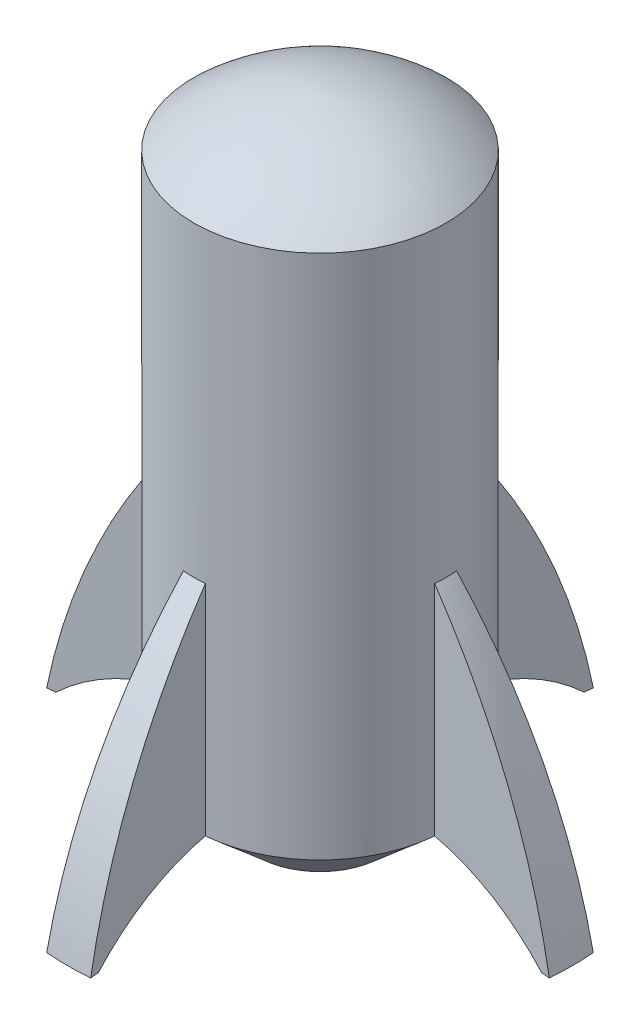
ISO-10303-21;
HEADER;
FILE_DESCRIPTION(('STEP AP214'),'2;1');
FILE_NAME('part.step','',(''),(''),'','','');
FILE_SCHEMA(('AUTOMOTIVE_DESIGN { 1 0 10303 214 1 1 1 1 }'));
ENDSEC;
DATA;
#1=APPLICATION_CONTEXT('core data for automotive mechanical design processes');
#2=APPLICATION_PROTOCOL_DEFINITION('international standard','automotive_design',2000,#1);
#3=PRODUCT_CONTEXT('',#1,'mechanical');
#4=PRODUCT('Part','Part','',(#3));
#5=PRODUCT_RELATED_PRODUCT_CATEGORY('part','',(#4));
#6=PRODUCT_DEFINITION_FORMATION('','',#4);
#7=PRODUCT_DEFINITION_CONTEXT('part definition',#1,'design');
#8=PRODUCT_DEFINITION('design','',#6,#7);
#9=PRODUCT_DEFINITION_SHAPE('','',#8);
#10=(LENGTH_UNIT() NAMED_UNIT(*) SI_UNIT(.MILLI.,.METRE.));
#11=(NAMED_UNIT(*) PLANE_ANGLE_UNIT() SI_UNIT($,.RADIAN.));
#12=(NAMED_UNIT(*) SI_UNIT($,.STERADIAN.) SOLID_ANGLE_UNIT());
#13=UNCERTAINTY_MEASURE_WITH_UNIT(LENGTH_MEASURE(1.E-05),#10,'distance_accuracy_value','');
#14=(GEOMETRIC_REPRESENTATION_CONTEXT(3) GLOBAL_UNCERTAINTY_ASSIGNED_CONTEXT((#13)) GLOBAL_UNIT_ASSIGNED_CONTEXT((#10,
#11,#12)) REPRESENTATION_CONTEXT('',''));
#15=CARTESIAN_POINT('',(0.,0.,0.));
#16=DIRECTION('',(0.,0.,1.));
#17=DIRECTION('',(1.,0.,0.));
#18=AXIS2_PLACEMENT_3D('',#15,#16,#17);
#19=CARTESIAN_POINT('',(0.,100.066272480097,2.57349100796131));
#20=DIRECTION('',(-1.,0.,0.));
#21=DIRECTION('',(0.,0.,-1.));
#22=AXIS2_PLACEMENT_3D('',#19,#20,#21);
#23=CIRCLE('',#22,50.);
#24=TRIMMED_CURVE('',#23,(PARAMETER_VALUE(-1.51930375435487)),
(PARAMETER_VALUE(1.51930375435487)),.T.,.PARAMETER.);
#25=CARTESIAN_POINT('',(0.,100.066272480097,0.));
#26=DIRECTION('',(0.,-1.,0.));
#27=AXIS1_PLACEMENT('',#25,#26);
#28=SURFACE_OF_REVOLUTION('',#24,#27);
#29=CARTESIAN_POINT('',(0.,150.,0.));
#30=VERTEX_POINT('',#29);
#31=VERTEX_LOOP('',#30);
#32=FACE_BOUND('',#31,.T.);
#33=CARTESIAN_POINT('',(0.,138.,0.));
#34=DIRECTION('',(0.,-1.,0.));
#35=DIRECTION('',(0.,0.,-1.));
#36=AXIS2_PLACEMENT_3D('',#33,#34,#35);
#37=CIRCLE('',#36,30.);
#38=CARTESIAN_POINT('',(0.,138.,-30.));
#39=VERTEX_POINT('',#38);
#40=EDGE_CURVE('E358',#39,#39,#37,.T.);
#41=ORIENTED_EDGE('',*,*,#40,.F.);
#42=EDGE_LOOP('',(#41));
#43=FACE_BOUND('',#42,.T.);
#44=ADVANCED_FACE('F43',(#32,#43),#28,.T.);
#45=CARTESIAN_POINT('',(0.,0.,0.));
#46=DIRECTION('',(0.,-1.,0.));
#47=DIRECTION('',(0.,0.,-1.));
#48=AXIS2_PLACEMENT_3D('',#45,#46,#47);
#49=CYLINDRICAL_SURFACE('',#48,30.);
#50=DIRECTION('',(0.,-1.,0.));
#51=VECTOR('',#50,1.);
#52=CARTESIAN_POINT('',(-29.8858409427524,65.,2.61467228242944));
#53=LINE('',#52,#51);
#54=CARTESIAN_POINT('',(-29.8858409427524,65.,2.61467228242944));
#55=VERTEX_POINT('',#54);
#56=CARTESIAN_POINT('',(-29.8858409427524,13.,2.61467228242944));
#57=VERTEX_POINT('',#56);
#58=EDGE_CURVE('E201',#55,#57,#53,.T.);
#59=ORIENTED_EDGE('',*,*,#58,.T.);
#60=CARTESIAN_POINT('',(0.,13.,0.));
#61=DIRECTION('',(0.,-1.,0.));
#62=DIRECTION('',(0.,0.,-1.));
#63=AXIS2_PLACEMENT_3D('',#60,#61,#62);
#64=CIRCLE('',#63,30.);
#65=CARTESIAN_POINT('',(-2.61467228242975,13.,29.8858409427524));
#66=VERTEX_POINT('',#65);
#67=EDGE_CURVE('E701',#66,#57,#64,.T.);
#68=ORIENTED_EDGE('',*,*,#67,.F.);
#69=DIRECTION('',(0.,-1.,0.));
#70=VECTOR('',#69,1.);
#71=CARTESIAN_POINT('',(-2.61467228242975,65.,29.8858409427524));
#72=LINE('',#71,#70);
#73=CARTESIAN_POINT('',(-2.61467228242975,65.,29.8858409427524));
#74=VERTEX_POINT('',#73);
#75=EDGE_CURVE('E223',#74,#66,#72,.T.);
#76=ORIENTED_EDGE('',*,*,#75,.F.);
#77=CARTESIAN_POINT('',(0.,65.,0.));
#78=DIRECTION('',(0.,-1.,0.));
#79=DIRECTION('',(0.,0.,1.));
#80=AXIS2_PLACEMENT_3D('',#77,#78,#79);
#81=CIRCLE('',#80,30.);
#82=CARTESIAN_POINT('',(2.61467228242975,65.,29.8858409427524));
#83=VERTEX_POINT('',#82);
#84=EDGE_CURVE('E248',#83,#74,#81,.T.);
#85=ORIENTED_EDGE('',*,*,#84,.F.);
#86=DIRECTION('',(0.,-1.,0.));
#87=VECTOR('',#86,1.);
#88=CARTESIAN_POINT('',(2.61467228242975,65.,29.8858409427524));
#89=LINE('',#88,#87);
#90=CARTESIAN_POINT('',(2.61467228242975,13.,29.8858409427524));
#91=VERTEX_POINT('',#90);
#92=EDGE_CURVE('E236',#83,#91,#89,.T.);
#93=ORIENTED_EDGE('',*,*,#92,.T.);
#94=CARTESIAN_POINT('',(29.8858409427524,13.,2.61467228242985));
#95=VERTEX_POINT('',#94);
#96=EDGE_CURVE('E359',#95,#91,#64,.T.);
#97=ORIENTED_EDGE('',*,*,#96,.F.);
#98=DIRECTION('',(0.,-1.,0.));
#99=VECTOR('',#98,1.);
#100=CARTESIAN_POINT('',(29.8858409427524,65.,2.61467228242986));
#101=LINE('',#100,#99);
#102=CARTESIAN_POINT('',(29.8858409427524,65.,2.61467228242986));
#103=VERTEX_POINT('',#102);
#104=EDGE_CURVE('E265',#103,#95,#101,.T.);
#105=ORIENTED_EDGE('',*,*,#104,.F.);
#106=CARTESIAN_POINT('',(0.,65.,0.));
#107=DIRECTION('',(0.,-1.,0.));
#108=DIRECTION('',(1.,0.,0.));
#109=AXIS2_PLACEMENT_3D('',#106,#107,#108);
#110=CIRCLE('',#109,30.);
#111=CARTESIAN_POINT('',(29.8858409427524,65.,-2.61467228242965));
#112=VERTEX_POINT('',#111);
#113=EDGE_CURVE('E293',#112,#103,#110,.T.);
#114=ORIENTED_EDGE('',*,*,#113,.F.);
#115=DIRECTION('',(0.,-1.,0.));
#116=VECTOR('',#115,1.);
#117=CARTESIAN_POINT('',(29.8858409427524,65.,-2.61467228242965));
#118=LINE('',#117,#116);
#119=CARTESIAN_POINT('',(29.8858409427524,13.,-2.61467228242965));
#120=VERTEX_POINT('',#119);
#121=EDGE_CURVE('E281',#112,#120,#118,.T.);
#122=ORIENTED_EDGE('',*,*,#121,.T.);
#123=CARTESIAN_POINT('',(2.61467228242975,13.,-29.8858409427524));
#124=VERTEX_POINT('',#123);
#125=EDGE_CURVE('E354',#124,#120,#64,.T.);
#126=ORIENTED_EDGE('',*,*,#125,.F.);
#127=DIRECTION('',(0.,-1.,0.));
#128=VECTOR('',#127,1.);
#129=CARTESIAN_POINT('',(2.61467228242975,65.,-29.8858409427524));
#130=LINE('',#129,#128);
#131=CARTESIAN_POINT('',(2.61467228242975,65.,-29.8858409427524));
#132=VERTEX_POINT('',#131);
#133=EDGE_CURVE('E310',#132,#124,#130,.T.);
#134=ORIENTED_EDGE('',*,*,#133,.F.);
#135=CARTESIAN_POINT('',(0.,65.,0.));
#136=DIRECTION('',(0.,-1.,0.));
#137=DIRECTION('',(0.,0.,-1.));
#138=AXIS2_PLACEMENT_3D('',#135,#136,#137);
#139=CIRCLE('',#138,30.);
#140=CARTESIAN_POINT('',(-2.61467228242975,65.,-29.8858409427524));
#141=VERTEX_POINT('',#140);
#142=EDGE_CURVE('E337',#141,#132,#139,.T.);
#143=ORIENTED_EDGE('',*,*,#142,.F.);
#144=DIRECTION('',(0.,-1.,0.));
#145=VECTOR('',#144,1.);
#146=CARTESIAN_POINT('',(-2.61467228242975,65.,-29.8858409427524));
#147=LINE('',#146,#145);
#148=CARTESIAN_POINT('',(-2.61467228242975,13.,-29.8858409427524));
#149=VERTEX_POINT('',#148);
#150=EDGE_CURVE('E326',#141,#149,#147,.T.);
#151=ORIENTED_EDGE('',*,*,#150,.T.);
#152=CARTESIAN_POINT('',(-29.8858409427523,13.,-2.61467228243006));
#153=VERTEX_POINT('',#152);
#154=EDGE_CURVE('E190',#153,#149,#64,.T.);
#155=ORIENTED_EDGE('',*,*,#154,.F.);
#156=DIRECTION('',(0.,-1.,0.));
#157=VECTOR('',#156,1.);
#158=CARTESIAN_POINT('',(-29.8858409427523,65.,-2.61467228243006));
#159=LINE('',#158,#157);
#160=CARTESIAN_POINT('',(-29.8858409427523,65.,-2.61467228243006));
#161=VERTEX_POINT('',#160);
#162=EDGE_CURVE('E181',#161,#153,#159,.T.);
#163=ORIENTED_EDGE('',*,*,#162,.F.);
#164=CARTESIAN_POINT('',(0.,65.,0.));
#165=DIRECTION('',(0.,-1.,0.));
#166=DIRECTION('',(-1.,0.,0.));
#167=AXIS2_PLACEMENT_3D('',#164,#165,#166);
#168=CIRCLE('',#167,30.);
#169=EDGE_CURVE('E165',#55,#161,#168,.T.);
#170=ORIENTED_EDGE('',*,*,#169,.F.);
#171=EDGE_LOOP('',(#59,#68,#76,#85,#93,#97,#105,#114,#122,#126,#134,#143,#151,#155,#163,#170));
#172=FACE_BOUND('',#171,.T.);
#173=ORIENTED_EDGE('',*,*,#40,.T.);
#174=EDGE_LOOP('',(#173));
#175=FACE_BOUND('',#174,.T.);
#176=ADVANCED_FACE('F187',(#172,#175),#49,.T.);
#177=CARTESIAN_POINT('',(0.,0.,0.));
#178=DIRECTION('',(0.,1.,0.));
#179=DIRECTION('',(0.,0.,1.));
#180=AXIS2_PLACEMENT_3D('',#177,#178,#179);
#181=CONICAL_SURFACE('',#180,15.,0.856705628182739);
#182=ORIENTED_EDGE('',*,*,#125,.T.);
#183=CARTESIAN_POINT('',(0.,13.,0.));
#184=DIRECTION('',(0.,-1.,0.));
#185=DIRECTION('',(1.,0.,0.));
#186=AXIS2_PLACEMENT_3D('',#183,#184,#185);
#187=CIRCLE('',#186,30.);
#188=EDGE_CURVE('E296',#120,#95,#187,.T.);
#189=ORIENTED_EDGE('',*,*,#188,.T.);
#190=ORIENTED_EDGE('',*,*,#96,.T.);
#191=CARTESIAN_POINT('',(0.,13.,0.));
#192=DIRECTION('',(0.,-1.,0.));
#193=DIRECTION('',(0.,0.,1.));
#194=AXIS2_PLACEMENT_3D('',#191,#192,#193);
#195=CIRCLE('',#194,30.);
#196=EDGE_CURVE('E251',#91,#66,#195,.T.);
#197=ORIENTED_EDGE('',*,*,#196,.T.);
#198=ORIENTED_EDGE('',*,*,#67,.T.);
#199=CARTESIAN_POINT('',(0.,13.,0.));
#200=DIRECTION('',(0.,-1.,0.));
#201=DIRECTION('',(-1.,0.,0.));
#202=AXIS2_PLACEMENT_3D('',#199,#200,#201);
#203=CIRCLE('',#202,30.);
#204=EDGE_CURVE('E175',#57,#153,#203,.T.);
#205=ORIENTED_EDGE('',*,*,#204,.T.);
#206=ORIENTED_EDGE('',*,*,#154,.T.);
#207=CARTESIAN_POINT('',(0.,13.,0.));
#208=DIRECTION('',(0.,-1.,0.));
#209=DIRECTION('',(0.,0.,-1.));
#210=AXIS2_PLACEMENT_3D('',#207,#208,#209);
#211=CIRCLE('',#210,30.);
#212=EDGE_CURVE('E340',#149,#124,#211,.T.);
#213=ORIENTED_EDGE('',*,*,#212,.T.);
#214=EDGE_LOOP('',(#182,#189,#190,#197,#198,#205,#206,#213));
#215=FACE_BOUND('',#214,.T.);
#216=CARTESIAN_POINT('',(0.,0.,0.));
#217=DIRECTION('',(0.,-1.,0.));
#218=DIRECTION('',(0.,0.,-1.));
#219=AXIS2_PLACEMENT_3D('',#216,#217,#218);
#220=CIRCLE('',#219,15.);
#221=CARTESIAN_POINT('',(0.,0.,-15.));
#222=VERTEX_POINT('',#221);
#223=EDGE_CURVE('E350',#222,#222,#220,.T.);
#224=ORIENTED_EDGE('',*,*,#223,.F.);
#225=EDGE_LOOP('',(#224));
#226=FACE_BOUND('',#225,.T.);
#227=ADVANCED_FACE('F393',(#215,#226),#181,.T.);
#228=CARTESIAN_POINT('',(0.,0.,0.));
#229=DIRECTION('',(0.,-1.,0.));
#230=DIRECTION('',(0.,0.,-1.));
#231=AXIS2_PLACEMENT_3D('',#228,#229,#230);
#232=PLANE('',#231);
#233=ORIENTED_EDGE('',*,*,#223,.T.);
#234=EDGE_LOOP('',(#233));
#235=FACE_BOUND('',#234,.T.);
#236=ADVANCED_FACE('F396',(#235),#232,.T.);
#237=CARTESIAN_POINT('',(0.,-28.5427678942815,0.));
#238=DIRECTION('',(0.,-1.,0.));
#239=DIRECTION('',(0.,0.,-1.));
#240=AXIS2_PLACEMENT_3D('',#237,#238,#239);
#241=DEGENERATE_TOROIDAL_SURFACE('',#240,87.2593304376099,150.,.F.);
#242=CARTESIAN_POINT('',(0.,0.,0.));
#243=DIRECTION('',(0.,-1.,0.));
#244=DIRECTION('',(0.,0.,-1.));
#245=AXIS2_PLACEMENT_3D('',#242,#243,#244);
#246=CIRCLE('',#245,60.);
#247=CARTESIAN_POINT('',(-5.2293445648595,0.,-59.7716818855047));
#248=VERTEX_POINT('',#247);
#249=CARTESIAN_POINT('',(5.2293445648595,0.,-59.7716818855047));
#250=VERTEX_POINT('',#249);
#251=EDGE_CURVE('E347',#248,#250,#246,.T.);
#252=ORIENTED_EDGE('',*,*,#251,.F.);
#253=CARTESIAN_POINT('',(7.60515175595324,-28.5427678942815,86.9272823409826));
#254=DIRECTION('',(0.996194698091746,0.,-0.0871557427476583));
#255=DIRECTION('',(0.0871557427476583,0.,0.996194698091746));
#256=AXIS2_PLACEMENT_3D('',#253,#254,#255);
#257=CIRCLE('',#256,150.);
#258=EDGE_CURVE('E322',#248,#141,#257,.T.);
#259=ORIENTED_EDGE('',*,*,#258,.T.);
#260=ORIENTED_EDGE('',*,*,#142,.T.);
#261=CARTESIAN_POINT('',(-7.60515175595324,-28.5427678942815,86.9272823409826));
#262=DIRECTION('',(0.996194698091746,0.,0.0871557427476584));
#263=DIRECTION('',(-0.0871557427476584,0.,0.996194698091746));
#264=AXIS2_PLACEMENT_3D('',#261,#262,#263);
#265=CIRCLE('',#264,150.);
#266=EDGE_CURVE('E306',#250,#132,#265,.T.);
#267=ORIENTED_EDGE('',*,*,#266,.F.);
#268=EDGE_LOOP('',(#252,#259,#260,#267));
#269=FACE_BOUND('',#268,.T.);
#270=ADVANCED_FACE('F400',(#269),#241,.F.);
#271=CARTESIAN_POINT('',(-5.2293445648595,0.,-59.7716818855047));
#272=DIRECTION('',(0.,-1.,0.));
#273=DIRECTION('',(0.,0.,-1.));
#274=AXIS2_PLACEMENT_3D('',#271,#272,#273);
#275=PLANE('',#274);
#276=CARTESIAN_POINT('',(0.,0.,0.));
#277=DIRECTION('',(0.,-1.,0.));
#278=DIRECTION('',(0.,0.,-1.));
#279=AXIS2_PLACEMENT_3D('',#276,#277,#278);
#280=CIRCLE('',#279,58.);
#281=CARTESIAN_POINT('',(-5.05503307936418,0.,-57.7792924893212));
#282=VERTEX_POINT('',#281);
#283=CARTESIAN_POINT('',(5.05503307936419,0.,-57.7792924893212));
#284=VERTEX_POINT('',#283);
#285=EDGE_CURVE('E344',#282,#284,#280,.T.);
#286=ORIENTED_EDGE('',*,*,#285,.F.);
#287=DIRECTION('',(-0.0871557427476583,0.,-0.996194698091746));
#288=VECTOR('',#287,1.);
#289=CARTESIAN_POINT('',(-5.2293445648595,0.,-59.7716818855047));
#290=LINE('',#289,#288);
#291=EDGE_CURVE('E333',#282,#248,#290,.T.);
#292=ORIENTED_EDGE('',*,*,#291,.T.);
#293=ORIENTED_EDGE('',*,*,#251,.T.);
#294=DIRECTION('',(0.0871557427476584,0.,-0.996194698091746));
#295=VECTOR('',#294,1.);
#296=CARTESIAN_POINT('',(5.2293445648595,0.,-59.7716818855047));
#297=LINE('',#296,#295);
#298=EDGE_CURVE('E318',#284,#250,#297,.T.);
#299=ORIENTED_EDGE('',*,*,#298,.F.);
#300=EDGE_LOOP('',(#286,#292,#293,#299));
#301=FACE_BOUND('',#300,.T.);
#302=ADVANCED_FACE('F402',(#301),#275,.T.);
#303=CARTESIAN_POINT('',(0.,-36.6354050513055,0.));
#304=DIRECTION('',(0.,-1.,0.));
#305=DIRECTION('',(0.,0.,-1.));
#306=AXIS2_PLACEMENT_3D('',#303,#304,#305);
#307=DEGENERATE_TOROIDAL_SURFACE('',#306,23.9728476547511,50.,.T.);
#308=ORIENTED_EDGE('',*,*,#212,.F.);
#309=CARTESIAN_POINT('',(-2.08937134312629,-36.6354050513055,-23.8816237318241));
#310=DIRECTION('',(-0.996194698091746,0.,0.0871557427476583));
#311=DIRECTION('',(0.0871557427476583,0.,0.996194698091746));
#312=AXIS2_PLACEMENT_3D('',#309,#310,#311);
#313=CIRCLE('',#312,50.);
#314=EDGE_CURVE('E329',#149,#282,#313,.T.);
#315=ORIENTED_EDGE('',*,*,#314,.T.);
#316=ORIENTED_EDGE('',*,*,#285,.T.);
#317=CARTESIAN_POINT('',(2.08937134312629,-36.6354050513055,-23.8816237318241));
#318=DIRECTION('',(-0.996194698091746,0.,-0.0871557427476584));
#319=DIRECTION('',(-0.0871557427476584,0.,0.996194698091746));
#320=AXIS2_PLACEMENT_3D('',#317,#318,#319);
#321=CIRCLE('',#320,50.);
#322=EDGE_CURVE('E314',#124,#284,#321,.T.);
#323=ORIENTED_EDGE('',*,*,#322,.F.);
#324=EDGE_LOOP('',(#308,#315,#316,#323));
#325=FACE_BOUND('',#324,.T.);
#326=ADVANCED_FACE('F405',(#325),#307,.F.);
#327=CARTESIAN_POINT('',(7.60515175595324,-28.5427678942815,86.9272823409826));
#328=DIRECTION('',(-0.996194698091746,0.,0.0871557427476583));
#329=DIRECTION('',(0.0871557427476583,0.,0.996194698091746));
#330=AXIS2_PLACEMENT_3D('',#327,#328,#329);
#331=PLANE('',#330);
#332=ORIENTED_EDGE('',*,*,#258,.F.);
#333=ORIENTED_EDGE('',*,*,#291,.F.);
#334=ORIENTED_EDGE('',*,*,#314,.F.);
#335=ORIENTED_EDGE('',*,*,#150,.F.);
#336=EDGE_LOOP('',(#332,#333,#334,#335));
#337=FACE_BOUND('',#336,.T.);
#338=ADVANCED_FACE('F409',(#337),#331,.T.);
#339=CARTESIAN_POINT('',(-7.60515175595324,-28.5427678942815,86.9272823409826));
#340=DIRECTION('',(-0.996194698091746,0.,-0.0871557427476584));
#341=DIRECTION('',(-0.0871557427476584,0.,0.996194698091746));
#342=AXIS2_PLACEMENT_3D('',#339,#340,#341);
#343=PLANE('',#342);
#344=ORIENTED_EDGE('',*,*,#266,.T.);
#345=ORIENTED_EDGE('',*,*,#133,.T.);
#346=ORIENTED_EDGE('',*,*,#322,.T.);
#347=ORIENTED_EDGE('',*,*,#298,.T.);
#348=EDGE_LOOP('',(#344,#345,#346,#347));
#349=FACE_BOUND('',#348,.T.);
#350=ADVANCED_FACE('F416',(#349),#343,.F.);
#351=CARTESIAN_POINT('',(0.,-28.5427678942815,0.));
#352=DIRECTION('',(0.,-1.,0.));
#353=DIRECTION('',(1.,0.,0.));
#354=AXIS2_PLACEMENT_3D('',#351,#352,#353);
#355=DEGENERATE_TOROIDAL_SURFACE('',#354,87.2593304376099,150.,.F.);
#356=CARTESIAN_POINT('',(0.,0.,0.));
#357=DIRECTION('',(0.,-1.,0.));
#358=DIRECTION('',(1.,0.,0.));
#359=AXIS2_PLACEMENT_3D('',#356,#357,#358);
#360=CIRCLE('',#359,60.);
#361=CARTESIAN_POINT('',(59.7716818855048,0.,-5.22934456485929));
#362=VERTEX_POINT('',#361);
#363=CARTESIAN_POINT('',(59.7716818855047,0.,5.22934456485971));
#364=VERTEX_POINT('',#363);
#365=EDGE_CURVE('E303',#362,#364,#360,.T.);
#366=ORIENTED_EDGE('',*,*,#365,.F.);
#367=CARTESIAN_POINT('',(-86.9272823409827,-28.5427678942815,7.60515175595294));
#368=DIRECTION('',(0.0871557427476549,0.,0.996194698091746));
#369=DIRECTION('',(-0.996194698091746,0.,0.0871557427476549));
#370=AXIS2_PLACEMENT_3D('',#367,#368,#369);
#371=CIRCLE('',#370,150.);
#372=EDGE_CURVE('E277',#362,#112,#371,.T.);
#373=ORIENTED_EDGE('',*,*,#372,.T.);
#374=ORIENTED_EDGE('',*,*,#113,.T.);
#375=CARTESIAN_POINT('',(-86.9272823409826,-28.5427678942815,-7.60515175595354));
#376=DIRECTION('',(-0.0871557427476618,0.,0.996194698091745));
#377=DIRECTION('',(-0.996194698091745,0.,-0.0871557427476618));
#378=AXIS2_PLACEMENT_3D('',#375,#376,#377);
#379=CIRCLE('',#378,150.);
#380=EDGE_CURVE('E261',#364,#103,#379,.T.);
#381=ORIENTED_EDGE('',*,*,#380,.F.);
#382=EDGE_LOOP('',(#366,#373,#374,#381));
#383=FACE_BOUND('',#382,.T.);
#384=ADVANCED_FACE('F420',(#383),#355,.F.);
#385=CARTESIAN_POINT('',(59.7716818855048,0.,-5.22934456485929));
#386=DIRECTION('',(0.,-1.,0.));
#387=DIRECTION('',(1.,0.,0.));
#388=AXIS2_PLACEMENT_3D('',#385,#386,#387);
#389=PLANE('',#388);
#390=CARTESIAN_POINT('',(0.,0.,0.));
#391=DIRECTION('',(0.,-1.,0.));
#392=DIRECTION('',(1.,0.,0.));
#393=AXIS2_PLACEMENT_3D('',#390,#391,#392);
#394=CIRCLE('',#393,58.);
#395=CARTESIAN_POINT('',(57.7792924893213,0.,-5.05503307936398));
#396=VERTEX_POINT('',#395);
#397=CARTESIAN_POINT('',(57.7792924893212,0.,5.05503307936439));
#398=VERTEX_POINT('',#397);
#399=EDGE_CURVE('E300',#396,#398,#394,.T.);
#400=ORIENTED_EDGE('',*,*,#399,.F.);
#401=DIRECTION('',(0.996194698091746,0.,-0.0871557427476549));
#402=VECTOR('',#401,1.);
#403=CARTESIAN_POINT('',(59.7716818855048,0.,-5.22934456485929));
#404=LINE('',#403,#402);
#405=EDGE_CURVE('E289',#396,#362,#404,.T.);
#406=ORIENTED_EDGE('',*,*,#405,.T.);
#407=ORIENTED_EDGE('',*,*,#365,.T.);
#408=DIRECTION('',(0.996194698091745,0.,0.0871557427476618));
#409=VECTOR('',#408,1.);
#410=CARTESIAN_POINT('',(59.7716818855047,0.,5.22934456485971));
#411=LINE('',#410,#409);
#412=EDGE_CURVE('E273',#398,#364,#411,.T.);
#413=ORIENTED_EDGE('',*,*,#412,.F.);
#414=EDGE_LOOP('',(#400,#406,#407,#413));
#415=FACE_BOUND('',#414,.T.);
#416=ADVANCED_FACE('F422',(#415),#389,.T.);
#417=CARTESIAN_POINT('',(0.,-36.6354050513055,0.));
#418=DIRECTION('',(0.,-1.,0.));
#419=DIRECTION('',(1.,0.,0.));
#420=AXIS2_PLACEMENT_3D('',#417,#418,#419);
#421=DEGENERATE_TOROIDAL_SURFACE('',#420,23.9728476547511,50.,.T.);
#422=ORIENTED_EDGE('',*,*,#188,.F.);
#423=CARTESIAN_POINT('',(23.8816237318241,-36.6354050513055,-2.0893713431262));
#424=DIRECTION('',(-0.0871557427476549,0.,-0.996194698091746));
#425=DIRECTION('',(-0.996194698091746,0.,0.0871557427476549));
#426=AXIS2_PLACEMENT_3D('',#423,#424,#425);
#427=CIRCLE('',#426,50.);
#428=EDGE_CURVE('E285',#120,#396,#427,.T.);
#429=ORIENTED_EDGE('',*,*,#428,.T.);
#430=ORIENTED_EDGE('',*,*,#399,.T.);
#431=CARTESIAN_POINT('',(23.8816237318241,-36.6354050513055,2.08937134312637));
#432=DIRECTION('',(0.0871557427476618,0.,-0.996194698091745));
#433=DIRECTION('',(-0.996194698091745,0.,-0.0871557427476618));
#434=AXIS2_PLACEMENT_3D('',#431,#432,#433);
#435=CIRCLE('',#434,50.);
#436=EDGE_CURVE('E269',#95,#398,#435,.T.);
#437=ORIENTED_EDGE('',*,*,#436,.F.);
#438=EDGE_LOOP('',(#422,#429,#430,#437));
#439=FACE_BOUND('',#438,.T.);
#440=ADVANCED_FACE('F425',(#439),#421,.F.);
#441=CARTESIAN_POINT('',(-86.9272823409827,-28.5427678942815,7.60515175595294));
#442=DIRECTION('',(-0.0871557427476549,0.,-0.996194698091746));
#443=DIRECTION('',(-0.996194698091746,0.,0.0871557427476549));
#444=AXIS2_PLACEMENT_3D('',#441,#442,#443);
#445=PLANE('',#444);
#446=ORIENTED_EDGE('',*,*,#372,.F.);
#447=ORIENTED_EDGE('',*,*,#405,.F.);
#448=ORIENTED_EDGE('',*,*,#428,.F.);
#449=ORIENTED_EDGE('',*,*,#121,.F.);
#450=EDGE_LOOP('',(#446,#447,#448,#449));
#451=FACE_BOUND('',#450,.T.);
#452=ADVANCED_FACE('F429',(#451),#445,.T.);
#453=CARTESIAN_POINT('',(-86.9272823409826,-28.5427678942815,-7.60515175595354));
#454=DIRECTION('',(0.0871557427476618,0.,-0.996194698091745));
#455=DIRECTION('',(-0.996194698091745,0.,-0.0871557427476618));
#456=AXIS2_PLACEMENT_3D('',#453,#454,#455);
#457=PLANE('',#456);
#458=ORIENTED_EDGE('',*,*,#380,.T.);
#459=ORIENTED_EDGE('',*,*,#104,.T.);
#460=ORIENTED_EDGE('',*,*,#436,.T.);
#461=ORIENTED_EDGE('',*,*,#412,.T.);
#462=EDGE_LOOP('',(#458,#459,#460,#461));
#463=FACE_BOUND('',#462,.T.);
#464=ADVANCED_FACE('F436',(#463),#457,.F.);
#465=CARTESIAN_POINT('',(0.,-28.5427678942815,0.));
#466=DIRECTION('',(0.,-1.,0.));
#467=DIRECTION('',(0.,0.,1.));
#468=AXIS2_PLACEMENT_3D('',#465,#466,#467);
#469=DEGENERATE_TOROIDAL_SURFACE('',#468,87.2593304376099,150.,.F.);
#470=CARTESIAN_POINT('',(0.,0.,0.));
#471=DIRECTION('',(0.,-1.,0.));
#472=DIRECTION('',(0.,0.,1.));
#473=AXIS2_PLACEMENT_3D('',#470,#471,#472);
#474=CIRCLE('',#473,60.);
#475=CARTESIAN_POINT('',(5.2293445648595,0.,59.7716818855047));
#476=VERTEX_POINT('',#475);
#477=CARTESIAN_POINT('',(-5.2293445648595,0.,59.7716818855047));
#478=VERTEX_POINT('',#477);
#479=EDGE_CURVE('E258',#476,#478,#474,.T.);
#480=ORIENTED_EDGE('',*,*,#479,.F.);
#481=CARTESIAN_POINT('',(-7.60515175595324,-28.5427678942815,-86.9272823409826));
#482=DIRECTION('',(-0.996194698091746,0.,0.0871557427476583));
#483=DIRECTION('',(-0.0871557427476583,0.,-0.996194698091746));
#484=AXIS2_PLACEMENT_3D('',#481,#482,#483);
#485=CIRCLE('',#484,150.);
#486=EDGE_CURVE('E232',#476,#83,#485,.T.);
#487=ORIENTED_EDGE('',*,*,#486,.T.);
#488=ORIENTED_EDGE('',*,*,#84,.T.);
#489=CARTESIAN_POINT('',(7.60515175595324,-28.5427678942815,-86.9272823409826));
#490=DIRECTION('',(-0.996194698091746,0.,-0.0871557427476584));
#491=DIRECTION('',(0.0871557427476584,0.,-0.996194698091746));
#492=AXIS2_PLACEMENT_3D('',#489,#490,#491);
#493=CIRCLE('',#492,150.);
#494=EDGE_CURVE('E219',#478,#74,#493,.T.);
#495=ORIENTED_EDGE('',*,*,#494,.F.);
#496=EDGE_LOOP('',(#480,#487,#488,#495));
#497=FACE_BOUND('',#496,.T.);
#498=ADVANCED_FACE('F440',(#497),#469,.F.);
#499=CARTESIAN_POINT('',(5.2293445648595,0.,59.7716818855047));
#500=DIRECTION('',(0.,-1.,0.));
#501=DIRECTION('',(0.,0.,1.));
#502=AXIS2_PLACEMENT_3D('',#499,#500,#501);
#503=PLANE('',#502);
#504=CARTESIAN_POINT('',(0.,0.,0.));
#505=DIRECTION('',(0.,-1.,0.));
#506=DIRECTION('',(0.,0.,1.));
#507=AXIS2_PLACEMENT_3D('',#504,#505,#506);
#508=CIRCLE('',#507,58.);
#509=CARTESIAN_POINT('',(5.05503307936418,0.,57.7792924893212));
#510=VERTEX_POINT('',#509);
#511=CARTESIAN_POINT('',(-5.05503307936419,0.,57.7792924893212));
#512=VERTEX_POINT('',#511);
#513=EDGE_CURVE('E255',#510,#512,#508,.T.);
#514=ORIENTED_EDGE('',*,*,#513,.F.);
#515=DIRECTION('',(0.0871557427476583,0.,0.996194698091746));
#516=VECTOR('',#515,1.);
#517=CARTESIAN_POINT('',(5.2293445648595,0.,59.7716818855047));
#518=LINE('',#517,#516);
#519=EDGE_CURVE('E244',#510,#476,#518,.T.);
#520=ORIENTED_EDGE('',*,*,#519,.T.);
#521=ORIENTED_EDGE('',*,*,#479,.T.);
#522=DIRECTION('',(-0.0871557427476584,0.,0.996194698091746));
#523=VECTOR('',#522,1.);
#524=CARTESIAN_POINT('',(-5.2293445648595,0.,59.7716818855047));
#525=LINE('',#524,#523);
#526=EDGE_CURVE('E228',#512,#478,#525,.T.);
#527=ORIENTED_EDGE('',*,*,#526,.F.);
#528=EDGE_LOOP('',(#514,#520,#521,#527));
#529=FACE_BOUND('',#528,.T.);
#530=ADVANCED_FACE('F442',(#529),#503,.T.);
#531=CARTESIAN_POINT('',(0.,-36.6354050513055,0.));
#532=DIRECTION('',(0.,-1.,0.));
#533=DIRECTION('',(0.,0.,1.));
#534=AXIS2_PLACEMENT_3D('',#531,#532,#533);
#535=DEGENERATE_TOROIDAL_SURFACE('',#534,23.9728476547511,50.,.T.);
#536=ORIENTED_EDGE('',*,*,#196,.F.);
#537=CARTESIAN_POINT('',(2.08937134312629,-36.6354050513055,23.8816237318241));
#538=DIRECTION('',(0.996194698091746,0.,-0.0871557427476583));
#539=DIRECTION('',(-0.0871557427476583,0.,-0.996194698091746));
#540=AXIS2_PLACEMENT_3D('',#537,#538,#539);
#541=CIRCLE('',#540,50.);
#542=EDGE_CURVE('E240',#91,#510,#541,.T.);
#543=ORIENTED_EDGE('',*,*,#542,.T.);
#544=ORIENTED_EDGE('',*,*,#513,.T.);
#545=CARTESIAN_POINT('',(-2.08937134312629,-36.6354050513055,23.8816237318241));
#546=DIRECTION('',(0.996194698091746,0.,0.0871557427476584));
#547=DIRECTION('',(0.0871557427476584,0.,-0.996194698091746));
#548=AXIS2_PLACEMENT_3D('',#545,#546,#547);
#549=CIRCLE('',#548,50.);
#550=EDGE_CURVE('E68',#66,#512,#549,.T.);
#551=ORIENTED_EDGE('',*,*,#550,.F.);
#552=EDGE_LOOP('',(#536,#543,#544,#551));
#553=FACE_BOUND('',#552,.T.);
#554=ADVANCED_FACE('F445',(#553),#535,.F.);
#555=CARTESIAN_POINT('',(-7.60515175595324,-28.5427678942815,-86.9272823409826));
#556=DIRECTION('',(0.996194698091746,0.,-0.0871557427476583));
#557=DIRECTION('',(-0.0871557427476583,0.,-0.996194698091746));
#558=AXIS2_PLACEMENT_3D('',#555,#556,#557);
#559=PLANE('',#558);
#560=ORIENTED_EDGE('',*,*,#486,.F.);
#561=ORIENTED_EDGE('',*,*,#519,.F.);
#562=ORIENTED_EDGE('',*,*,#542,.F.);
#563=ORIENTED_EDGE('',*,*,#92,.F.);
#564=EDGE_LOOP('',(#560,#561,#562,#563));
#565=FACE_BOUND('',#564,.T.);
#566=ADVANCED_FACE('F449',(#565),#559,.T.);
#567=CARTESIAN_POINT('',(7.60515175595324,-28.5427678942815,-86.9272823409826));
#568=DIRECTION('',(0.996194698091746,0.,0.0871557427476584));
#569=DIRECTION('',(0.0871557427476584,0.,-0.996194698091746));
#570=AXIS2_PLACEMENT_3D('',#567,#568,#569);
#571=PLANE('',#570);
#572=ORIENTED_EDGE('',*,*,#494,.T.);
#573=ORIENTED_EDGE('',*,*,#75,.T.);
#574=ORIENTED_EDGE('',*,*,#550,.T.);
#575=ORIENTED_EDGE('',*,*,#526,.T.);
#576=EDGE_LOOP('',(#572,#573,#574,#575));
#577=FACE_BOUND('',#576,.T.);
#578=ADVANCED_FACE('F455',(#577),#571,.F.);
#579=CARTESIAN_POINT('',(0.,-28.5427678942815,0.));
#580=DIRECTION('',(0.,-1.,0.));
#581=DIRECTION('',(-1.,0.,0.));
#582=AXIS2_PLACEMENT_3D('',#579,#580,#581);
#583=DEGENERATE_TOROIDAL_SURFACE('',#582,87.2593304376099,150.,.F.);
#584=CARTESIAN_POINT('',(0.,0.,0.));
#585=DIRECTION('',(0.,-1.,0.));
#586=DIRECTION('',(-1.,0.,0.));
#587=AXIS2_PLACEMENT_3D('',#584,#585,#586);
#588=CIRCLE('',#587,60.);
#589=CARTESIAN_POINT('',(-59.7716818855048,0.,5.22934456485887));
#590=VERTEX_POINT('',#589);
#591=CARTESIAN_POINT('',(-59.7716818855047,0.,-5.22934456486013));
#592=VERTEX_POINT('',#591);
#593=EDGE_CURVE('E216',#590,#592,#588,.T.);
#594=ORIENTED_EDGE('',*,*,#593,.F.);
#595=CARTESIAN_POINT('',(86.9272823409827,-28.5427678942815,-7.60515175595233));
#596=DIRECTION('',(-0.0871557427476479,0.,-0.996194698091746));
#597=DIRECTION('',(0.996194698091746,0.,-0.0871557427476479));
#598=AXIS2_PLACEMENT_3D('',#595,#596,#597);
#599=CIRCLE('',#598,150.);
#600=EDGE_CURVE('E170',#590,#55,#599,.T.);
#601=ORIENTED_EDGE('',*,*,#600,.T.);
#602=ORIENTED_EDGE('',*,*,#169,.T.);
#603=CARTESIAN_POINT('',(86.9272823409825,-28.5427678942815,7.60515175595415));
#604=DIRECTION('',(0.0871557427476688,0.,-0.996194698091745));
#605=DIRECTION('',(0.996194698091745,0.,0.0871557427476688));
#606=AXIS2_PLACEMENT_3D('',#603,#604,#605);
#607=CIRCLE('',#606,150.);
#608=EDGE_CURVE('E168',#592,#161,#607,.T.);
#609=ORIENTED_EDGE('',*,*,#608,.F.);
#610=EDGE_LOOP('',(#594,#601,#602,#609));
#611=FACE_BOUND('',#610,.T.);
#612=ADVANCED_FACE('F167',(#611),#583,.F.);
#613=CARTESIAN_POINT('',(-59.7716818855048,0.,5.22934456485887));
#614=DIRECTION('',(0.,-1.,0.));
#615=DIRECTION('',(-1.,0.,0.));
#616=AXIS2_PLACEMENT_3D('',#613,#614,#615);
#617=PLANE('',#616);
#618=CARTESIAN_POINT('',(0.,0.,0.));
#619=DIRECTION('',(0.,-1.,0.));
#620=DIRECTION('',(-1.,0.,0.));
#621=AXIS2_PLACEMENT_3D('',#618,#619,#620);
#622=CIRCLE('',#621,58.);
#623=CARTESIAN_POINT('',(-57.7792924893213,0.,5.05503307936358));
#624=VERTEX_POINT('',#623);
#625=CARTESIAN_POINT('',(-57.7792924893212,0.,-5.05503307936479));
#626=VERTEX_POINT('',#625);
#627=EDGE_CURVE('E213',#624,#626,#622,.T.);
#628=ORIENTED_EDGE('',*,*,#627,.F.);
#629=DIRECTION('',(-0.996194698091746,0.,0.0871557427476479));
#630=VECTOR('',#629,1.);
#631=CARTESIAN_POINT('',(-59.7716818855048,0.,5.22934456485887));
#632=LINE('',#631,#630);
#633=EDGE_CURVE('E176',#624,#590,#632,.T.);
#634=ORIENTED_EDGE('',*,*,#633,.T.);
#635=ORIENTED_EDGE('',*,*,#593,.T.);
#636=DIRECTION('',(-0.996194698091745,0.,-0.0871557427476688));
#637=VECTOR('',#636,1.);
#638=CARTESIAN_POINT('',(-59.7716818855047,0.,-5.22934456486013));
#639=LINE('',#638,#637);
#640=EDGE_CURVE('E184',#626,#592,#639,.T.);
#641=ORIENTED_EDGE('',*,*,#640,.F.);
#642=EDGE_LOOP('',(#628,#634,#635,#641));
#643=FACE_BOUND('',#642,.T.);
#644=ADVANCED_FACE('F460',(#643),#617,.T.);
#645=CARTESIAN_POINT('',(0.,-36.6354050513055,0.));
#646=DIRECTION('',(0.,-1.,0.));
#647=DIRECTION('',(-1.,0.,0.));
#648=AXIS2_PLACEMENT_3D('',#645,#646,#647);
#649=DEGENERATE_TOROIDAL_SURFACE('',#648,23.9728476547511,50.,.T.);
#650=ORIENTED_EDGE('',*,*,#204,.F.);
#651=CARTESIAN_POINT('',(-23.8816237318242,-36.6354050513055,2.08937134312604));
#652=DIRECTION('',(0.0871557427476479,0.,0.996194698091746));
#653=DIRECTION('',(0.996194698091746,0.,-0.0871557427476479));
#654=AXIS2_PLACEMENT_3D('',#651,#652,#653);
#655=CIRCLE('',#654,50.);
#656=EDGE_CURVE('E204',#57,#624,#655,.T.);
#657=ORIENTED_EDGE('',*,*,#656,.T.);
#658=ORIENTED_EDGE('',*,*,#627,.T.);
#659=CARTESIAN_POINT('',(-23.8816237318241,-36.6354050513055,-2.08937134312654));
#660=DIRECTION('',(-0.0871557427476688,0.,0.996194698091745));
#661=DIRECTION('',(0.996194698091745,0.,0.0871557427476688));
#662=AXIS2_PLACEMENT_3D('',#659,#660,#661);
#663=CIRCLE('',#662,50.);
#664=EDGE_CURVE('E60',#153,#626,#663,.T.);
#665=ORIENTED_EDGE('',*,*,#664,.F.);
#666=EDGE_LOOP('',(#650,#657,#658,#665));
#667=FACE_BOUND('',#666,.T.);
#668=ADVANCED_FACE('F463',(#667),#649,.F.);
#669=CARTESIAN_POINT('',(86.9272823409827,-28.5427678942815,-7.60515175595233));
#670=DIRECTION('',(0.0871557427476479,0.,0.996194698091746));
#671=DIRECTION('',(0.996194698091746,0.,-0.0871557427476479));
#672=AXIS2_PLACEMENT_3D('',#669,#670,#671);
#673=PLANE('',#672);
#674=ORIENTED_EDGE('',*,*,#600,.F.);
#675=ORIENTED_EDGE('',*,*,#633,.F.);
#676=ORIENTED_EDGE('',*,*,#656,.F.);
#677=ORIENTED_EDGE('',*,*,#58,.F.);
#678=EDGE_LOOP('',(#674,#675,#676,#677));
#679=FACE_BOUND('',#678,.T.);
#680=ADVANCED_FACE('F467',(#679),#673,.T.);
#681=CARTESIAN_POINT('',(86.9272823409825,-28.5427678942815,7.60515175595415));
#682=DIRECTION('',(-0.0871557427476688,0.,0.996194698091745));
#683=DIRECTION('',(0.996194698091745,0.,0.0871557427476688));
#684=AXIS2_PLACEMENT_3D('',#681,#682,#683);
#685=PLANE('',#684);
#686=ORIENTED_EDGE('',*,*,#608,.T.);
#687=ORIENTED_EDGE('',*,*,#162,.T.);
#688=ORIENTED_EDGE('',*,*,#664,.T.);
#689=ORIENTED_EDGE('',*,*,#640,.T.);
#690=EDGE_LOOP('',(#686,#687,#688,#689));
#691=FACE_BOUND('',#690,.T.);
#692=ADVANCED_FACE('F180',(#691),#685,.F.);
#693=CLOSED_SHELL('',(#44,#176,#227,#236,#270,#302,#326,#338,#350,#384,#416,#440,#452,#464,#498,
#530,#554,#566,#578,#612,#644,#668,#680,#692));
#694=CARTESIAN_POINT('',(0.,2.,0.));
#695=DIRECTION('',(0.,1.,0.));
#696=DIRECTION('',(0.,0.,1.));
#697=AXIS2_PLACEMENT_3D('',#694,#695,#696);
#698=PLANE('',#697);
#699=CARTESIAN_POINT('',(0.,2.,0.));
#700=DIRECTION('',(0.,-1.,0.));
#701=DIRECTION('',(0.,0.,-1.));
#702=AXIS2_PLACEMENT_3D('',#699,#700,#701);
#703=CIRCLE('',#702,14.2539333474955);
#704=CARTESIAN_POINT('',(0.,2.,-14.2539333474955));
#705=VERTEX_POINT('',#704);
#706=EDGE_CURVE('E11',#705,#705,#703,.T.);
#707=ORIENTED_EDGE('',*,*,#706,.F.);
#708=EDGE_LOOP('',(#707));
#709=FACE_BOUND('',#708,.T.);
#710=ADVANCED_FACE('F45',(#709),#698,.T.);
#711=CARTESIAN_POINT('',(0.,13.9132577655039,0.));
#712=DIRECTION('',(0.,1.,0.));
#713=DIRECTION('',(0.,0.,1.));
#714=AXIS2_PLACEMENT_3D('',#711,#712,#713);
#715=CONICAL_SURFACE('',#714,28.,0.856705628182739);
#716=ORIENTED_EDGE('',*,*,#706,.T.);
#717=EDGE_LOOP('',(#716));
#718=FACE_BOUND('',#717,.T.);
#719=CARTESIAN_POINT('',(0.,13.9132577655039,0.));
#720=DIRECTION('',(0.,-1.,0.));
#721=DIRECTION('',(0.,0.,-1.));
#722=AXIS2_PLACEMENT_3D('',#719,#720,#721);
#723=CIRCLE('',#722,28.);
#724=CARTESIAN_POINT('',(0.,13.9132577655039,-28.));
#725=VERTEX_POINT('',#724);
#726=EDGE_CURVE('E53',#725,#725,#723,.T.);
#727=ORIENTED_EDGE('',*,*,#726,.F.);
#728=EDGE_LOOP('',(#727));
#729=FACE_BOUND('',#728,.T.);
#730=ADVANCED_FACE('F373',(#718,#729),#715,.F.);
#731=CARTESIAN_POINT('',(0.,0.,0.));
#732=DIRECTION('',(0.,-1.,0.));
#733=DIRECTION('',(0.,0.,-1.));
#734=AXIS2_PLACEMENT_3D('',#731,#732,#733);
#735=CYLINDRICAL_SURFACE('',#734,28.);
#736=ORIENTED_EDGE('',*,*,#726,.T.);
#737=EDGE_LOOP('',(#736));
#738=FACE_BOUND('',#737,.T.);
#739=CARTESIAN_POINT('',(0.,137.069808089361,0.));
#740=DIRECTION('',(0.,-1.,0.));
#741=DIRECTION('',(0.,0.,-1.));
#742=AXIS2_PLACEMENT_3D('',#739,#740,#741);
#743=CIRCLE('',#742,28.);
#744=CARTESIAN_POINT('',(0.,137.069808089361,-28.));
#745=VERTEX_POINT('',#744);
#746=EDGE_CURVE('E363',#745,#745,#743,.T.);
#747=ORIENTED_EDGE('',*,*,#746,.F.);
#748=EDGE_LOOP('',(#747));
#749=FACE_BOUND('',#748,.T.);
#750=ADVANCED_FACE('F370',(#738,#749),#735,.F.);
#751=CARTESIAN_POINT('',(0.,100.066272480097,2.57349100796131));
#752=DIRECTION('',(-1.,0.,0.));
#753=DIRECTION('',(0.,0.,-1.));
#754=AXIS2_PLACEMENT_3D('',#751,#752,#753);
#755=CIRCLE('',#754,48.);
#756=TRIMMED_CURVE('',#755,(PARAMETER_VALUE(-1.51715621171903)),
(PARAMETER_VALUE(1.51715621171903)),.T.,.PARAMETER.);
#757=CARTESIAN_POINT('',(0.,100.066272480097,0.));
#758=DIRECTION('',(0.,-1.,0.));
#759=AXIS1_PLACEMENT('',#757,#758);
#760=SURFACE_OF_REVOLUTION('',#756,#759);
#761=ORIENTED_EDGE('',*,*,#746,.T.);
#762=EDGE_LOOP('',(#761));
#763=FACE_BOUND('',#762,.T.);
#764=CARTESIAN_POINT('',(0.,147.997234749093,0.));
#765=VERTEX_POINT('',#764);
#766=VERTEX_LOOP('',#765);
#767=FACE_BOUND('',#766,.T.);
#768=ADVANCED_FACE('F381',(#763,#767),#760,.F.);
#769=CLOSED_SHELL('',(#710,#730,#750,#768));
#770=ORIENTED_CLOSED_SHELL('',*,#769,.T.);
#771=BREP_WITH_VOIDS('B2',#693,(#770));
#772=ADVANCED_BREP_SHAPE_REPRESENTATION('',(#18,#771),#14);
#773=SHAPE_DEFINITION_REPRESENTATION(#9,#772);
ENDSEC;
END-ISO-10303-21;
